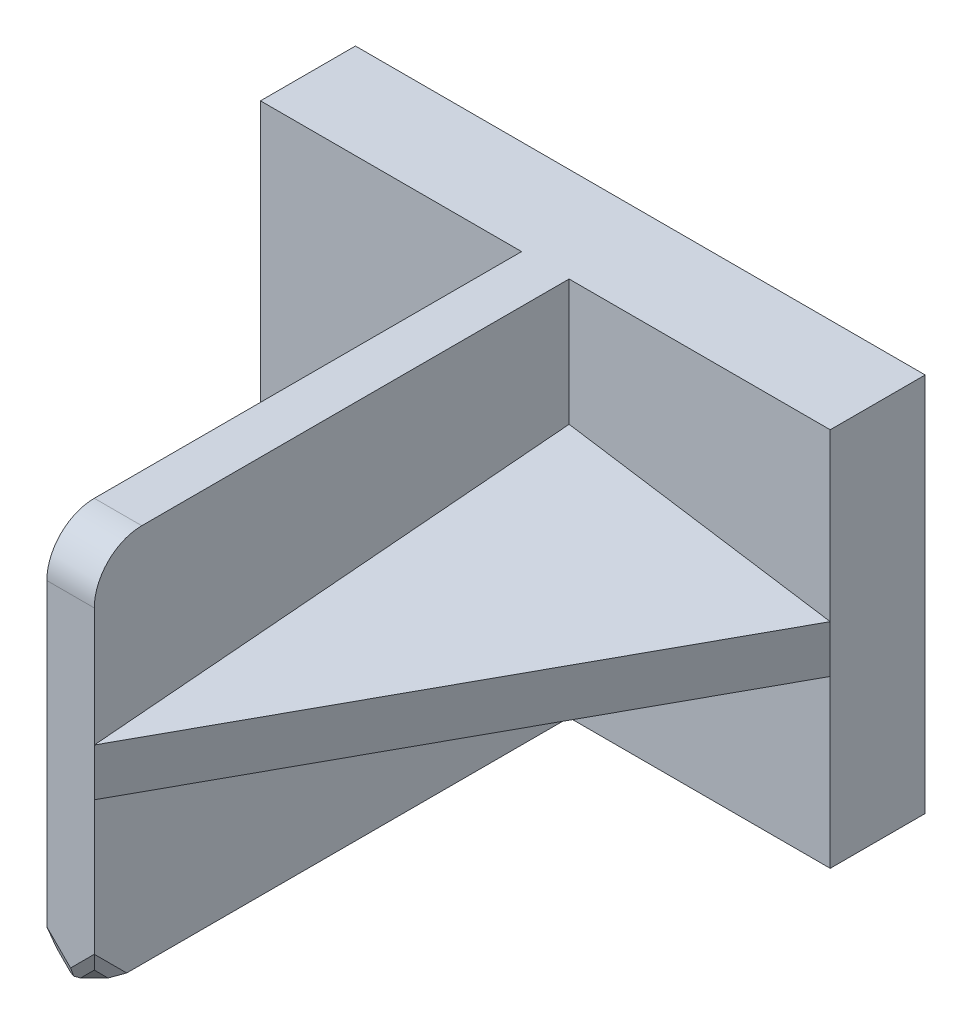
ISO-10303-21;
HEADER;
FILE_DESCRIPTION(('STEP AP214'),'2;1');
FILE_NAME('part.step','',(''),(''),'','','');
FILE_SCHEMA(('AUTOMOTIVE_DESIGN { 1 0 10303 214 1 1 1 1 }'));
ENDSEC;
DATA;
#1=APPLICATION_CONTEXT('core data for automotive mechanical design processes');
#2=APPLICATION_PROTOCOL_DEFINITION('international standard','automotive_design',2000,#1);
#3=PRODUCT_CONTEXT('',#1,'mechanical');
#4=PRODUCT('Part','Part','',(#3));
#5=PRODUCT_RELATED_PRODUCT_CATEGORY('part','',(#4));
#6=PRODUCT_DEFINITION_FORMATION('','',#4);
#7=PRODUCT_DEFINITION_CONTEXT('part definition',#1,'design');
#8=PRODUCT_DEFINITION('design','',#6,#7);
#9=PRODUCT_DEFINITION_SHAPE('','',#8);
#10=(LENGTH_UNIT() NAMED_UNIT(*) SI_UNIT(.MILLI.,.METRE.));
#11=(NAMED_UNIT(*) PLANE_ANGLE_UNIT() SI_UNIT($,.RADIAN.));
#12=(NAMED_UNIT(*) SI_UNIT($,.STERADIAN.) SOLID_ANGLE_UNIT());
#13=UNCERTAINTY_MEASURE_WITH_UNIT(LENGTH_MEASURE(1.E-05),#10,'distance_accuracy_value','');
#14=(GEOMETRIC_REPRESENTATION_CONTEXT(3) GLOBAL_UNCERTAINTY_ASSIGNED_CONTEXT((#13)) GLOBAL_UNIT_ASSIGNED_CONTEXT((#10,
#11,#12)) REPRESENTATION_CONTEXT('',''));
#15=CARTESIAN_POINT('',(0.,0.,0.));
#16=DIRECTION('',(0.,0.,1.));
#17=DIRECTION('',(1.,0.,0.));
#18=AXIS2_PLACEMENT_3D('',#15,#16,#17);
#19=CARTESIAN_POINT('',(0.,0.,20.));
#20=DIRECTION('',(0.,0.,1.));
#21=DIRECTION('',(1.,0.,0.));
#22=AXIS2_PLACEMENT_3D('',#19,#20,#21);
#23=PLANE('',#22);
#24=DIRECTION('',(0.,1.,0.));
#25=VECTOR('',#24,1.);
#26=CARTESIAN_POINT('',(60.,-40.,20.));
#27=LINE('',#26,#25);
#28=CARTESIAN_POINT('',(60.,-40.,20.));
#29=VERTEX_POINT('',#28);
#30=CARTESIAN_POINT('',(60.,-5.,20.));
#31=VERTEX_POINT('',#30);
#32=EDGE_CURVE('E204',#29,#31,#27,.T.);
#33=ORIENTED_EDGE('',*,*,#32,.T.);
#34=DIRECTION('',(-0.988274307004356,-0.152688880129039,0.));
#35=VECTOR('',#34,1.);
#36=CARTESIAN_POINT('',(2.15332613288759,-13.9373403612325,20.));
#37=LINE('',#36,#35);
#38=CARTESIAN_POINT('',(5.,-13.4975278094123,20.));
#39=VERTEX_POINT('',#38);
#40=EDGE_CURVE('E317',#31,#39,#37,.T.);
#41=ORIENTED_EDGE('',*,*,#40,.T.);
#42=DIRECTION('',(0.,1.,0.));
#43=VECTOR('',#42,1.);
#44=CARTESIAN_POINT('',(5.,40.,20.));
#45=LINE('',#44,#43);
#46=CARTESIAN_POINT('',(5.00000000000001,-40.,20.));
#47=VERTEX_POINT('',#46);
#48=EDGE_CURVE('E345',#47,#39,#45,.T.);
#49=ORIENTED_EDGE('',*,*,#48,.F.);
#50=DIRECTION('',(1.,0.,0.));
#51=VECTOR('',#50,1.);
#52=CARTESIAN_POINT('',(60.,-40.,20.));
#53=LINE('',#52,#51);
#54=EDGE_CURVE('E211',#47,#29,#53,.T.);
#55=ORIENTED_EDGE('',*,*,#54,.T.);
#56=EDGE_LOOP('',(#33,#41,#49,#55));
#57=FACE_BOUND('',#56,.T.);
#58=ADVANCED_FACE('F45',(#57),#23,.T.);
#59=CARTESIAN_POINT('',(5.,40.,120.));
#60=DIRECTION('',(-1.,0.,0.));
#61=DIRECTION('',(0.,0.,1.));
#62=AXIS2_PLACEMENT_3D('',#59,#60,#61);
#63=PLANE('',#62);
#64=DIRECTION('',(0.,1.,0.));
#65=VECTOR('',#64,1.);
#66=CARTESIAN_POINT('',(5.,40.,120.));
#67=LINE('',#66,#65);
#68=CARTESIAN_POINT('',(5.,-33.1698729810778,120.));
#69=VERTEX_POINT('',#68);
#70=CARTESIAN_POINT('',(5.,-5.,120.));
#71=VERTEX_POINT('',#70);
#72=EDGE_CURVE('E344',#69,#71,#67,.T.);
#73=ORIENTED_EDGE('',*,*,#72,.F.);
#74=DIRECTION('',(0.,-0.707106781186548,-0.707106781186548));
#75=VECTOR('',#74,1.);
#76=CARTESIAN_POINT('',(5.,-39.0849364905389,114.084936490539));
#77=LINE('',#76,#75);
#78=CARTESIAN_POINT('',(5.,-40.,113.169872981078));
#79=VERTEX_POINT('',#78);
#80=EDGE_CURVE('E383',#69,#79,#77,.T.);
#81=ORIENTED_EDGE('',*,*,#80,.T.);
#82=DIRECTION('',(0.,0.,-1.));
#83=VECTOR('',#82,1.);
#84=CARTESIAN_POINT('',(5.,-40.,120.));
#85=LINE('',#84,#83);
#86=EDGE_CURVE('E335',#79,#47,#85,.T.);
#87=ORIENTED_EDGE('',*,*,#86,.T.);
#88=ORIENTED_EDGE('',*,*,#48,.T.);
#89=DIRECTION('',(0.,-0.0846701349816076,-0.996409036612071));
#90=VECTOR('',#89,1.);
#91=CARTESIAN_POINT('',(5.,-4.67739357089883,123.796473943208));
#92=LINE('',#91,#90);
#93=EDGE_CURVE('E187',#71,#39,#92,.T.);
#94=ORIENTED_EDGE('',*,*,#93,.F.);
#95=EDGE_LOOP('',(#73,#81,#87,#88,#94));
#96=FACE_BOUND('',#95,.T.);
#97=ADVANCED_FACE('F306',(#96),#63,.F.);
#98=DIRECTION('',(0.,-1.,0.));
#99=VECTOR('',#98,1.);
#100=CARTESIAN_POINT('',(-60.,-40.,20.));
#101=LINE('',#100,#99);
#102=CARTESIAN_POINT('',(-60.,40.,20.));
#103=VERTEX_POINT('',#102);
#104=CARTESIAN_POINT('',(-60.,-40.,20.));
#105=VERTEX_POINT('',#104);
#106=EDGE_CURVE('E232',#103,#105,#101,.T.);
#107=ORIENTED_EDGE('',*,*,#106,.T.);
#108=CARTESIAN_POINT('',(-4.99999999999997,-40.,20.));
#109=VERTEX_POINT('',#108);
#110=EDGE_CURVE('E205',#105,#109,#53,.T.);
#111=ORIENTED_EDGE('',*,*,#110,.T.);
#112=DIRECTION('',(0.,-1.,0.));
#113=VECTOR('',#112,1.);
#114=CARTESIAN_POINT('',(-5.,40.,20.));
#115=LINE('',#114,#113);
#116=CARTESIAN_POINT('',(-4.99999999999997,40.,20.));
#117=VERTEX_POINT('',#116);
#118=EDGE_CURVE('E177',#117,#109,#115,.T.);
#119=ORIENTED_EDGE('',*,*,#118,.F.);
#120=DIRECTION('',(-1.,0.,0.));
#121=VECTOR('',#120,1.);
#122=CARTESIAN_POINT('',(60.,40.,20.));
#123=LINE('',#122,#121);
#124=EDGE_CURVE('E209',#117,#103,#123,.T.);
#125=ORIENTED_EDGE('',*,*,#124,.T.);
#126=EDGE_LOOP('',(#107,#111,#119,#125));
#127=FACE_BOUND('',#126,.T.);
#128=ADVANCED_FACE('F288',(#127),#23,.T.);
#129=CARTESIAN_POINT('',(-60.,-40.,20.));
#130=DIRECTION('',(1.,0.,0.));
#131=DIRECTION('',(0.,0.,-1.));
#132=AXIS2_PLACEMENT_3D('',#129,#130,#131);
#133=PLANE('',#132);
#134=DIRECTION('',(0.,0.,-1.));
#135=VECTOR('',#134,1.);
#136=CARTESIAN_POINT('',(-60.,-40.,20.));
#137=LINE('',#136,#135);
#138=CARTESIAN_POINT('',(-60.,-40.,0.));
#139=VERTEX_POINT('',#138);
#140=EDGE_CURVE('E242',#105,#139,#137,.T.);
#141=ORIENTED_EDGE('',*,*,#140,.F.);
#142=ORIENTED_EDGE('',*,*,#106,.F.);
#143=DIRECTION('',(0.,0.,-1.));
#144=VECTOR('',#143,1.);
#145=CARTESIAN_POINT('',(-60.,40.,20.));
#146=LINE('',#145,#144);
#147=CARTESIAN_POINT('',(-60.,40.,0.));
#148=VERTEX_POINT('',#147);
#149=EDGE_CURVE('E218',#103,#148,#146,.T.);
#150=ORIENTED_EDGE('',*,*,#149,.T.);
#151=DIRECTION('',(0.,-1.,0.));
#152=VECTOR('',#151,1.);
#153=CARTESIAN_POINT('',(-60.,-40.,0.));
#154=LINE('',#153,#152);
#155=EDGE_CURVE('E219',#148,#139,#154,.T.);
#156=ORIENTED_EDGE('',*,*,#155,.T.);
#157=EDGE_LOOP('',(#141,#142,#150,#156));
#158=FACE_BOUND('',#157,.T.);
#159=ADVANCED_FACE('F299',(#158),#133,.F.);
#160=CARTESIAN_POINT('',(60.,-40.,20.));
#161=DIRECTION('',(0.,1.,0.));
#162=DIRECTION('',(-1.,0.,0.));
#163=AXIS2_PLACEMENT_3D('',#160,#161,#162);
#164=PLANE('',#163);
#165=DIRECTION('',(0.707106781186547,0.,0.707106781186547));
#166=VECTOR('',#165,1.);
#167=CARTESIAN_POINT('',(-20.,-40.,100.));
#168=LINE('',#167,#166);
#169=CARTESIAN_POINT('',(-3.94337567297408,-40.,116.056624327026));
#170=VERTEX_POINT('',#169);
#171=CARTESIAN_POINT('',(-1.05662432702594,-40.,118.943375672974));
#172=VERTEX_POINT('',#171);
#173=EDGE_CURVE('E414',#170,#172,#168,.T.);
#174=ORIENTED_EDGE('',*,*,#173,.F.);
#175=DIRECTION('',(-0.343723769333441,0.,-0.939070801588044));
#176=VECTOR('',#175,1.);
#177=CARTESIAN_POINT('',(-16.2181906126948,-40.,82.5212062582035));
#178=LINE('',#177,#176);
#179=CARTESIAN_POINT('',(-5.,-40.,113.169872981078));
#180=VERTEX_POINT('',#179);
#181=EDGE_CURVE('E395',#170,#180,#178,.T.);
#182=ORIENTED_EDGE('',*,*,#181,.T.);
#183=DIRECTION('',(0.,0.,-1.));
#184=VECTOR('',#183,1.);
#185=CARTESIAN_POINT('',(-5.,-40.,120.));
#186=LINE('',#185,#184);
#187=EDGE_CURVE('E223',#180,#109,#186,.T.);
#188=ORIENTED_EDGE('',*,*,#187,.T.);
#189=ORIENTED_EDGE('',*,*,#110,.F.);
#190=ORIENTED_EDGE('',*,*,#140,.T.);
#191=DIRECTION('',(1.,0.,0.));
#192=VECTOR('',#191,1.);
#193=CARTESIAN_POINT('',(60.,-40.,0.));
#194=LINE('',#193,#192);
#195=CARTESIAN_POINT('',(60.,-40.,0.));
#196=VERTEX_POINT('',#195);
#197=EDGE_CURVE('E222',#139,#196,#194,.T.);
#198=ORIENTED_EDGE('',*,*,#197,.T.);
#199=DIRECTION('',(0.,0.,-1.));
#200=VECTOR('',#199,1.);
#201=CARTESIAN_POINT('',(60.,-40.,20.));
#202=LINE('',#201,#200);
#203=EDGE_CURVE('E238',#29,#196,#202,.T.);
#204=ORIENTED_EDGE('',*,*,#203,.F.);
#205=ORIENTED_EDGE('',*,*,#54,.F.);
#206=ORIENTED_EDGE('',*,*,#86,.F.);
#207=DIRECTION('',(-0.343723769333443,0.,0.939070801588043));
#208=VECTOR('',#207,1.);
#209=CARTESIAN_POINT('',(16.2181906126948,-40.,82.5212062582036));
#210=LINE('',#209,#208);
#211=CARTESIAN_POINT('',(3.94337567297406,-40.,116.056624327026));
#212=VERTEX_POINT('',#211);
#213=EDGE_CURVE('E398',#79,#212,#210,.T.);
#214=ORIENTED_EDGE('',*,*,#213,.T.);
#215=DIRECTION('',(0.707106781186548,0.,-0.707106781186547));
#216=VECTOR('',#215,1.);
#217=CARTESIAN_POINT('',(80.,-40.,40.));
#218=LINE('',#217,#216);
#219=CARTESIAN_POINT('',(1.05662432702597,-40.,118.943375672974));
#220=VERTEX_POINT('',#219);
#221=EDGE_CURVE('E418',#220,#212,#218,.T.);
#222=ORIENTED_EDGE('',*,*,#221,.F.);
#223=DIRECTION('',(-0.939070801588043,0.,0.343723769333445));
#224=VECTOR('',#223,1.);
#225=CARTESIAN_POINT('',(18.2278095559281,-40.,112.658285666108));
#226=LINE('',#225,#224);
#227=CARTESIAN_POINT('',(0.,-40.,119.330127018922));
#228=VERTEX_POINT('',#227);
#229=EDGE_CURVE('E401',#220,#228,#226,.T.);
#230=ORIENTED_EDGE('',*,*,#229,.T.);
#231=DIRECTION('',(-0.939070801588042,0.,-0.343723769333447));
#232=VECTOR('',#231,1.);
#233=CARTESIAN_POINT('',(-18.2278095559281,-40.,112.658285666108));
#234=LINE('',#233,#232);
#235=EDGE_CURVE('E404',#228,#172,#234,.T.);
#236=ORIENTED_EDGE('',*,*,#235,.T.);
#237=EDGE_LOOP('',(#174,#182,#188,#189,#190,#198,#204,#205,#206,#214,#222,#230,#236));
#238=FACE_BOUND('',#237,.T.);
#239=ADVANCED_FACE('F297',(#238),#164,.F.);
#240=CARTESIAN_POINT('',(60.,-40.,20.));
#241=DIRECTION('',(-1.,0.,0.));
#242=DIRECTION('',(0.,0.,1.));
#243=AXIS2_PLACEMENT_3D('',#240,#241,#242);
#244=PLANE('',#243);
#245=CARTESIAN_POINT('',(60.,5.,20.));
#246=VERTEX_POINT('',#245);
#247=CARTESIAN_POINT('',(60.,40.,20.));
#248=VERTEX_POINT('',#247);
#249=EDGE_CURVE('E193',#246,#248,#27,.T.);
#250=ORIENTED_EDGE('',*,*,#249,.F.);
#251=DIRECTION('',(0.,1.,0.));
#252=VECTOR('',#251,1.);
#253=CARTESIAN_POINT('',(60.,0.,20.));
#254=LINE('',#253,#252);
#255=EDGE_CURVE('E164',#31,#246,#254,.T.);
#256=ORIENTED_EDGE('',*,*,#255,.F.);
#257=ORIENTED_EDGE('',*,*,#32,.F.);
#258=ORIENTED_EDGE('',*,*,#203,.T.);
#259=DIRECTION('',(0.,1.,0.));
#260=VECTOR('',#259,1.);
#261=CARTESIAN_POINT('',(60.,-40.,0.));
#262=LINE('',#261,#260);
#263=CARTESIAN_POINT('',(60.,40.,0.));
#264=VERTEX_POINT('',#263);
#265=EDGE_CURVE('E226',#196,#264,#262,.T.);
#266=ORIENTED_EDGE('',*,*,#265,.T.);
#267=DIRECTION('',(0.,0.,-1.));
#268=VECTOR('',#267,1.);
#269=CARTESIAN_POINT('',(60.,40.,20.));
#270=LINE('',#269,#268);
#271=EDGE_CURVE('E201',#248,#264,#270,.T.);
#272=ORIENTED_EDGE('',*,*,#271,.F.);
#273=EDGE_LOOP('',(#250,#256,#257,#258,#266,#272));
#274=FACE_BOUND('',#273,.T.);
#275=ADVANCED_FACE('F199',(#274),#244,.F.);
#276=CARTESIAN_POINT('',(60.,40.,20.));
#277=DIRECTION('',(0.,-1.,0.));
#278=DIRECTION('',(1.,0.,0.));
#279=AXIS2_PLACEMENT_3D('',#276,#277,#278);
#280=PLANE('',#279);
#281=DIRECTION('',(0.,0.,-1.));
#282=VECTOR('',#281,1.);
#283=CARTESIAN_POINT('',(-5.,40.,120.));
#284=LINE('',#283,#282);
#285=CARTESIAN_POINT('',(-5.,40.,110.));
#286=VERTEX_POINT('',#285);
#287=EDGE_CURVE('E341',#286,#117,#284,.T.);
#288=ORIENTED_EDGE('',*,*,#287,.F.);
#289=CARTESIAN_POINT('',(25.,40.,110.));
#290=CARTESIAN_POINT('',(18.3333333333333,40.,110.));
#291=CARTESIAN_POINT('',(11.6666666666666,40.,110.));
#292=CARTESIAN_POINT('',(4.99999999999998,40.,110.));
#293=CARTESIAN_POINT('',(1.66666666666665,40.,110.));
#294=CARTESIAN_POINT('',(-1.66666666666669,40.,110.));
#295=CARTESIAN_POINT('',(-5.00000000000002,40.,110.));
#296=CARTESIAN_POINT('',(-11.6666666666667,40.,110.));
#297=CARTESIAN_POINT('',(-18.3333333333334,40.,110.));
#298=CARTESIAN_POINT('',(-25.,40.,110.));
#299=(BOUNDED_CURVE() B_SPLINE_CURVE(3,(#289,#290,#291,#292,#293,#294,#295,#296,#297,#298),
.UNSPECIFIED.,.F.,.F.) B_SPLINE_CURVE_WITH_KNOTS((4,3,3,4),(-0.02,0.,0.01,0.03),
.UNSPECIFIED.) CURVE() GEOMETRIC_REPRESENTATION_ITEM() RATIONAL_B_SPLINE_CURVE((1.,1.,1.,1.,1.,
1.,1.,1.,1.,1.)) REPRESENTATION_ITEM(''));
#300=CARTESIAN_POINT('',(5.,40.,110.));
#301=VERTEX_POINT('',#300);
#302=EDGE_CURVE('E264',#286,#301,#299,.F.);
#303=ORIENTED_EDGE('',*,*,#302,.T.);
#304=DIRECTION('',(0.,0.,-1.));
#305=VECTOR('',#304,1.);
#306=CARTESIAN_POINT('',(5.,40.,120.));
#307=LINE('',#306,#305);
#308=CARTESIAN_POINT('',(5.,40.,20.));
#309=VERTEX_POINT('',#308);
#310=EDGE_CURVE('E338',#301,#309,#307,.T.);
#311=ORIENTED_EDGE('',*,*,#310,.T.);
#312=EDGE_CURVE('E215',#248,#309,#123,.T.);
#313=ORIENTED_EDGE('',*,*,#312,.F.);
#314=ORIENTED_EDGE('',*,*,#271,.T.);
#315=DIRECTION('',(-1.,0.,0.));
#316=VECTOR('',#315,1.);
#317=CARTESIAN_POINT('',(60.,40.,0.));
#318=LINE('',#317,#316);
#319=EDGE_CURVE('E229',#264,#148,#318,.T.);
#320=ORIENTED_EDGE('',*,*,#319,.T.);
#321=ORIENTED_EDGE('',*,*,#149,.F.);
#322=ORIENTED_EDGE('',*,*,#124,.F.);
#323=EDGE_LOOP('',(#288,#303,#311,#313,#314,#320,#321,#322));
#324=FACE_BOUND('',#323,.T.);
#325=ADVANCED_FACE('F287',(#324),#280,.F.);
#326=DIRECTION('',(0.988274307004356,-0.152688880129039,0.));
#327=VECTOR('',#326,1.);
#328=CARTESIAN_POINT('',(2.15332613288759,13.9373403612325,20.));
#329=LINE('',#328,#327);
#330=CARTESIAN_POINT('',(5.,13.4975278094123,20.));
#331=VERTEX_POINT('',#330);
#332=EDGE_CURVE('E178',#246,#331,#329,.F.);
#333=ORIENTED_EDGE('',*,*,#332,.F.);
#334=ORIENTED_EDGE('',*,*,#249,.T.);
#335=ORIENTED_EDGE('',*,*,#312,.T.);
#336=EDGE_CURVE('E196',#331,#309,#45,.T.);
#337=ORIENTED_EDGE('',*,*,#336,.F.);
#338=EDGE_LOOP('',(#333,#334,#335,#337));
#339=FACE_BOUND('',#338,.T.);
#340=ADVANCED_FACE('F191',(#339),#23,.T.);
#341=CARTESIAN_POINT('',(0.,0.,0.));
#342=DIRECTION('',(0.,0.,1.));
#343=DIRECTION('',(1.,0.,0.));
#344=AXIS2_PLACEMENT_3D('',#341,#342,#343);
#345=PLANE('',#344);
#346=ORIENTED_EDGE('',*,*,#319,.F.);
#347=ORIENTED_EDGE('',*,*,#265,.F.);
#348=ORIENTED_EDGE('',*,*,#197,.F.);
#349=ORIENTED_EDGE('',*,*,#155,.F.);
#350=EDGE_LOOP('',(#346,#347,#348,#349));
#351=FACE_BOUND('',#350,.T.);
#352=ADVANCED_FACE('F281',(#351),#345,.F.);
#353=CARTESIAN_POINT('',(-5.,40.,120.));
#354=DIRECTION('',(1.,0.,0.));
#355=DIRECTION('',(0.,0.,-1.));
#356=AXIS2_PLACEMENT_3D('',#353,#354,#355);
#357=PLANE('',#356);
#358=ORIENTED_EDGE('',*,*,#187,.F.);
#359=DIRECTION('',(0.,0.707106781186548,0.707106781186548));
#360=VECTOR('',#359,1.);
#361=CARTESIAN_POINT('',(-5.,-34.0849364905389,119.084936490539));
#362=LINE('',#361,#360);
#363=CARTESIAN_POINT('',(-5.,-33.1698729810778,120.));
#364=VERTEX_POINT('',#363);
#365=EDGE_CURVE('E392',#180,#364,#362,.T.);
#366=ORIENTED_EDGE('',*,*,#365,.T.);
#367=DIRECTION('',(0.,-1.,0.));
#368=VECTOR('',#367,1.);
#369=CARTESIAN_POINT('',(-5.,40.,120.));
#370=LINE('',#369,#368);
#371=CARTESIAN_POINT('',(-5.,30.,120.));
#372=VERTEX_POINT('',#371);
#373=EDGE_CURVE('E348',#372,#364,#370,.T.);
#374=ORIENTED_EDGE('',*,*,#373,.F.);
#375=CARTESIAN_POINT('',(-5.,30.,120.));
#376=CARTESIAN_POINT('',(-5.,30.2812605913706,120.000030243782));
#377=CARTESIAN_POINT('',(-5.,30.5625168391196,119.988135141236));
#378=CARTESIAN_POINT('',(-5.,31.1230170120515,119.940712684274));
#379=CARTESIAN_POINT('',(-5.,31.402261033115,119.905186463485));
#380=CARTESIAN_POINT('',(-5.,31.9565509876437,119.810755862172));
#381=CARTESIAN_POINT('',(-5.,32.2315999338214,119.751869166882));
#382=CARTESIAN_POINT('',(-5.,32.7757590317001,119.611145995811));
#383=CARTESIAN_POINT('',(-5.,33.044869255853,119.529309800179));
#384=CARTESIAN_POINT('',(-5.,33.575369034358,119.343221694075));
#385=CARTESIAN_POINT('',(-5.,33.8367548454142,119.238959111872));
#386=CARTESIAN_POINT('',(-5.,34.3498186080474,119.008780887676));
#387=CARTESIAN_POINT('',(-5.,34.6014963541576,118.882864787705));
#388=CARTESIAN_POINT('',(-5.,35.0933031638318,118.610301372502));
#389=CARTESIAN_POINT('',(-5.,35.3334343469466,118.463657881725));
#390=CARTESIAN_POINT('',(-5.,35.8004894871768,118.150665458572));
#391=CARTESIAN_POINT('',(-5.,36.0274135154347,117.984316632357));
#392=CARTESIAN_POINT('',(-5.,36.4664411767828,117.633096563488));
#393=CARTESIAN_POINT('',(-5.,36.6785449149973,117.448225452239));
#394=CARTESIAN_POINT('',(-5.,37.0864261250989,117.061273928005));
#395=CARTESIAN_POINT('',(-5.,37.2822035966153,116.85919351463));
#396=CARTESIAN_POINT('',(-5.,37.6560787992872,116.439216881484));
#397=CARTESIAN_POINT('',(-5.,37.834172921643,116.221317449028));
#398=CARTESIAN_POINT('',(-5.,38.1713670487199,115.771292369403));
#399=CARTESIAN_POINT('',(-5.00000000000001,38.3304673457236,115.539166941231));
#400=CARTESIAN_POINT('',(-5.00000000000001,38.6285774116808,115.062285832754));
#401=CARTESIAN_POINT('',(-5.,38.7675829145393,114.817527485421));
#402=CARTESIAN_POINT('',(-5.,39.0244719520883,114.317174678455));
#403=CARTESIAN_POINT('',(-5.,39.1423558384062,114.061580399303));
#404=CARTESIAN_POINT('',(-5.,39.3561178844524,113.541476220145));
#405=CARTESIAN_POINT('',(-5.,39.452006123747,113.276970467835));
#406=CARTESIAN_POINT('',(-5.,39.6211403399068,112.740926503363));
#407=CARTESIAN_POINT('',(-5.00000000000002,39.6943917596112,112.469389998733));
#408=CARTESIAN_POINT('',(-5.00000000000002,39.8371025211096,111.83507358538));
#409=CARTESIAN_POINT('',(-5.00000000000001,39.8981870551884,111.470354927913));
#410=CARTESIAN_POINT('',(-5.,39.9592676314228,110.920348880222));
#411=CARTESIAN_POINT('',(-5.,39.9745367725207,110.736618926843));
#412=CARTESIAN_POINT('',(-5.,39.9949017292727,110.368607713583));
#413=CARTESIAN_POINT('',(-5.00000000000001,39.9999981918544,110.184326489505));
#414=CARTESIAN_POINT('',(-5.00000000000002,40.,110.));
#415=B_SPLINE_CURVE_WITH_KNOTS('',3,(#375,#376,#377,#378,#379,#380,#381,#382,#383,#384,#385,
#386,#387,#388,#389,#390,#391,#392,#393,#394,#395,#396,#397,#398,#399,#400,#401,#402,#403,#404,
#405,#406,#407,#408,#409,#410,#411,#412,#413,#414),.UNSPECIFIED.,.F.,.F.,(4,2,2,2,2,2,2,2,2,2,2,
2,2,2,2,2,2,2,2,4),(0.,0.843524225534217,1.68700798857624,2.52985440039549,3.37269052387662,
4.21592860686621,5.05918452682158,5.90228505847178,6.74538104819435,7.58847105701003,
8.43156108497184,9.27482281775599,10.1180715725067,10.9614990856436,11.804912556303,
12.6479387548296,13.4907620965666,14.5975846256286,15.1504384772058,15.7032571691341),.UNSPECIFIED.);
#416=EDGE_CURVE('E252',#372,#286,#415,.T.);
#417=ORIENTED_EDGE('',*,*,#416,.T.);
#418=ORIENTED_EDGE('',*,*,#287,.T.);
#419=ORIENTED_EDGE('',*,*,#118,.T.);
#420=EDGE_LOOP('',(#358,#366,#374,#417,#418,#419));
#421=FACE_BOUND('',#420,.T.);
#422=ADVANCED_FACE('F275',(#421),#357,.F.);
#423=ORIENTED_EDGE('',*,*,#310,.F.);
#424=CARTESIAN_POINT('',(4.99999999999998,40.,110.));
#425=CARTESIAN_POINT('',(4.99999999999999,40.0000302437821,110.281260591371));
#426=CARTESIAN_POINT('',(5.,39.9881351412365,110.56251683912));
#427=CARTESIAN_POINT('',(5.,39.9407126842738,111.123017012052));
#428=CARTESIAN_POINT('',(5.,39.9051864634849,111.402261033115));
#429=CARTESIAN_POINT('',(5.,39.8107558621721,111.956550987644));
#430=CARTESIAN_POINT('',(5.,39.7518691668823,112.231599933821));
#431=CARTESIAN_POINT('',(5.,39.6111459958113,112.7757590317));
#432=CARTESIAN_POINT('',(4.99999999999998,39.529309800179,113.044869255853));
#433=CARTESIAN_POINT('',(4.99999999999998,39.3432216940754,113.575369034358));
#434=CARTESIAN_POINT('',(5.,39.2389591118716,113.836754845414));
#435=CARTESIAN_POINT('',(5.,39.0087808876758,114.349818608047));
#436=CARTESIAN_POINT('',(5.,38.8828647877046,114.601496354158));
#437=CARTESIAN_POINT('',(5.,38.6103013725019,115.093303163832));
#438=CARTESIAN_POINT('',(5.,38.4636578817249,115.333434346947));
#439=CARTESIAN_POINT('',(5.,38.1506654585722,115.800489487177));
#440=CARTESIAN_POINT('',(4.99999999999999,37.9843166323574,116.027413515435));
#441=CARTESIAN_POINT('',(4.99999999999999,37.6330965634878,116.466441176783));
#442=CARTESIAN_POINT('',(5.,37.4482254522391,116.678544914997));
#443=CARTESIAN_POINT('',(5.,37.0612739280053,117.086426125099));
#444=CARTESIAN_POINT('',(5.,36.8591935146295,117.282203596615));
#445=CARTESIAN_POINT('',(5.,36.4392168814837,117.656078799287));
#446=CARTESIAN_POINT('',(5.,36.2213174490276,117.834172921643));
#447=CARTESIAN_POINT('',(5.,35.7712923694028,118.17136704872));
#448=CARTESIAN_POINT('',(5.,35.5391669412311,118.330467345724));
#449=CARTESIAN_POINT('',(5.,35.0622858327538,118.628577411681));
#450=CARTESIAN_POINT('',(5.,34.8175274854212,118.767582914539));
#451=CARTESIAN_POINT('',(5.,34.3171746784549,119.024471952088));
#452=CARTESIAN_POINT('',(5.,34.0615803993027,119.142355838406));
#453=CARTESIAN_POINT('',(5.,33.5414762201447,119.356117884452));
#454=CARTESIAN_POINT('',(5.,33.2769704678345,119.452006123747));
#455=CARTESIAN_POINT('',(5.,32.7409265033632,119.621140339907));
#456=CARTESIAN_POINT('',(5.,32.4693899987334,119.694391759611));
#457=CARTESIAN_POINT('',(5.,31.8350735853804,119.83710252111));
#458=CARTESIAN_POINT('',(5.,31.4703549279125,119.898187055188));
#459=CARTESIAN_POINT('',(5.,30.9203488802216,119.959267631423));
#460=CARTESIAN_POINT('',(5.,30.7366189268432,119.974536772521));
#461=CARTESIAN_POINT('',(5.,30.3686077135829,119.994901729273));
#462=CARTESIAN_POINT('',(5.,30.1843264895054,119.999998191854));
#463=CARTESIAN_POINT('',(5.,30.,120.));
#464=B_SPLINE_CURVE_WITH_KNOTS('',3,(#424,#425,#426,#427,#428,#429,#430,#431,#432,#433,#434,
#435,#436,#437,#438,#439,#440,#441,#442,#443,#444,#445,#446,#447,#448,#449,#450,#451,#452,#453,
#454,#455,#456,#457,#458,#459,#460,#461,#462,#463),.UNSPECIFIED.,.F.,.F.,(4,2,2,2,2,2,2,2,2,2,2,
2,2,2,2,2,2,2,2,4),(0.,0.843524225534227,1.68700798857624,2.52985440039548,3.37269052387662,
4.21592860686621,5.0591845268216,5.9022850584718,6.74538104819438,7.58847105701007,
8.43156108497188,9.27482281775603,10.1180715725068,10.9614990856436,11.8049125563031,
12.6479387548297,13.4907620965667,14.5975846256286,15.1504384772058,15.7032571691341),.UNSPECIFIED.);
#465=CARTESIAN_POINT('',(5.,30.,120.));
#466=VERTEX_POINT('',#465);
#467=EDGE_CURVE('E421',#301,#466,#464,.T.);
#468=ORIENTED_EDGE('',*,*,#467,.T.);
#469=CARTESIAN_POINT('',(5.,5.,120.));
#470=VERTEX_POINT('',#469);
#471=EDGE_CURVE('E355',#470,#466,#67,.T.);
#472=ORIENTED_EDGE('',*,*,#471,.F.);
#473=DIRECTION('',(0.,-0.0846701349816076,0.996409036612071));
#474=VECTOR('',#473,1.);
#475=CARTESIAN_POINT('',(5.,5.25091611152312,117.047186933061));
#476=LINE('',#475,#474);
#477=EDGE_CURVE('E184',#470,#331,#476,.F.);
#478=ORIENTED_EDGE('',*,*,#477,.T.);
#479=ORIENTED_EDGE('',*,*,#336,.T.);
#480=EDGE_LOOP('',(#423,#468,#472,#478,#479));
#481=FACE_BOUND('',#480,.T.);
#482=ADVANCED_FACE('F280',(#481),#63,.F.);
#483=CARTESIAN_POINT('',(0.,0.,120.));
#484=DIRECTION('',(0.,0.,-1.));
#485=DIRECTION('',(-1.,0.,0.));
#486=AXIS2_PLACEMENT_3D('',#483,#484,#485);
#487=PLANE('',#486);
#488=DIRECTION('',(0.707106781186548,-0.707106781186547,0.));
#489=VECTOR('',#488,1.);
#490=CARTESIAN_POINT('',(0.915063509461122,-39.0849364905389,120.));
#491=LINE('',#490,#489);
#492=CARTESIAN_POINT('',(0.,-38.1698729810778,120.));
#493=VERTEX_POINT('',#492);
#494=EDGE_CURVE('E56',#364,#493,#491,.T.);
#495=ORIENTED_EDGE('',*,*,#494,.T.);
#496=DIRECTION('',(0.707106781186548,0.707106781186547,0.));
#497=VECTOR('',#496,1.);
#498=CARTESIAN_POINT('',(4.0849364905389,-34.0849364905389,120.));
#499=LINE('',#498,#497);
#500=EDGE_CURVE('E13',#493,#69,#499,.T.);
#501=ORIENTED_EDGE('',*,*,#500,.T.);
#502=ORIENTED_EDGE('',*,*,#72,.T.);
#503=EDGE_CURVE('E354',#71,#470,#67,.T.);
#504=ORIENTED_EDGE('',*,*,#503,.T.);
#505=ORIENTED_EDGE('',*,*,#471,.T.);
#506=CARTESIAN_POINT('',(25.,30.,120.));
#507=CARTESIAN_POINT('',(18.3333333333333,30.,120.));
#508=CARTESIAN_POINT('',(11.6666666666667,30.,120.));
#509=CARTESIAN_POINT('',(5.,30.,120.));
#510=CARTESIAN_POINT('',(1.66666666666667,30.,120.));
#511=CARTESIAN_POINT('',(-1.66666666666667,30.,120.));
#512=CARTESIAN_POINT('',(-5.,30.,120.));
#513=CARTESIAN_POINT('',(-11.6666666666667,30.,120.));
#514=CARTESIAN_POINT('',(-18.3333333333333,30.,120.));
#515=CARTESIAN_POINT('',(-25.,30.,120.));
#516=(BOUNDED_CURVE() B_SPLINE_CURVE(3,(#506,#507,#508,#509,#510,#511,#512,#513,#514,#515),
.UNSPECIFIED.,.F.,.F.) B_SPLINE_CURVE_WITH_KNOTS((4,3,3,4),(-0.02,0.,0.01,0.03),
.UNSPECIFIED.) CURVE() GEOMETRIC_REPRESENTATION_ITEM() RATIONAL_B_SPLINE_CURVE((1.,1.,1.,1.,1.,
1.,1.,1.,1.,1.)) REPRESENTATION_ITEM(''));
#517=EDGE_CURVE('E246',#466,#372,#516,.T.);
#518=ORIENTED_EDGE('',*,*,#517,.T.);
#519=ORIENTED_EDGE('',*,*,#373,.T.);
#520=EDGE_LOOP('',(#495,#501,#502,#504,#505,#518,#519));
#521=FACE_BOUND('',#520,.T.);
#522=ADVANCED_FACE('F436',(#521),#487,.F.);
#523=CARTESIAN_POINT('',(60.,0.,20.));
#524=DIRECTION('',(0.876215908676647,0.,0.481918749772156));
#525=DIRECTION('',(0.481918749772156,0.,-0.876215908676647));
#526=AXIS2_PLACEMENT_3D('',#523,#524,#525);
#527=PLANE('',#526);
#528=DIRECTION('',(0.481918749772156,0.,-0.876215908676647));
#529=VECTOR('',#528,1.);
#530=CARTESIAN_POINT('',(5.,-5.,120.));
#531=LINE('',#530,#529);
#532=EDGE_CURVE('E171',#71,#31,#531,.T.);
#533=ORIENTED_EDGE('',*,*,#532,.T.);
#534=ORIENTED_EDGE('',*,*,#255,.T.);
#535=DIRECTION('',(0.481918749772156,0.,-0.876215908676647));
#536=VECTOR('',#535,1.);
#537=CARTESIAN_POINT('',(5.,5.,120.));
#538=LINE('',#537,#536);
#539=EDGE_CURVE('E168',#470,#246,#538,.T.);
#540=ORIENTED_EDGE('',*,*,#539,.F.);
#541=ORIENTED_EDGE('',*,*,#503,.F.);
#542=EDGE_LOOP('',(#533,#534,#540,#541));
#543=FACE_BOUND('',#542,.T.);
#544=ADVANCED_FACE('F166',(#543),#527,.T.);
#545=CARTESIAN_POINT('',(5.,5.,120.));
#546=DIRECTION('',(-0.152153295784474,-0.984807753012208,-0.0836843126814604));
#547=DIRECTION('',(0.988274307004356,-0.152688880129039,0.));
#548=AXIS2_PLACEMENT_3D('',#545,#546,#547);
#549=PLANE('',#548);
#550=ORIENTED_EDGE('',*,*,#539,.T.);
#551=ORIENTED_EDGE('',*,*,#332,.T.);
#552=ORIENTED_EDGE('',*,*,#477,.F.);
#553=EDGE_LOOP('',(#550,#551,#552));
#554=FACE_BOUND('',#553,.T.);
#555=ADVANCED_FACE('F182',(#554),#549,.F.);
#556=CARTESIAN_POINT('',(5.,-5.,120.));
#557=DIRECTION('',(-0.152153295784474,0.984807753012208,-0.0836843126814604));
#558=DIRECTION('',(-0.988274307004356,-0.152688880129039,0.));
#559=AXIS2_PLACEMENT_3D('',#556,#557,#558);
#560=PLANE('',#559);
#561=ORIENTED_EDGE('',*,*,#40,.F.);
#562=ORIENTED_EDGE('',*,*,#532,.F.);
#563=ORIENTED_EDGE('',*,*,#93,.T.);
#564=EDGE_LOOP('',(#561,#562,#563));
#565=FACE_BOUND('',#564,.T.);
#566=ADVANCED_FACE('F544',(#565),#560,.F.);
#567=CARTESIAN_POINT('',(7.00000000000003,30.,120.));
#568=CARTESIAN_POINT('',(6.33333333333335,30.,120.));
#569=CARTESIAN_POINT('',(5.66666666666667,30.,120.));
#570=CARTESIAN_POINT('',(5.,30.,120.));
#571=CARTESIAN_POINT('',(1.66666666666667,30.,120.));
#572=CARTESIAN_POINT('',(-1.66666666666667,30.,120.));
#573=CARTESIAN_POINT('',(-5.,30.,120.));
#574=CARTESIAN_POINT('',(-5.66666666666667,30.,120.));
#575=CARTESIAN_POINT('',(-6.33333333333333,30.,120.));
#576=CARTESIAN_POINT('',(-7.,30.,120.));
#577=CARTESIAN_POINT('',(7.00000000000002,40.,120.));
#578=CARTESIAN_POINT('',(6.33333333333335,40.,120.));
#579=CARTESIAN_POINT('',(5.66666666666667,40.,120.));
#580=CARTESIAN_POINT('',(5.,40.,120.));
#581=CARTESIAN_POINT('',(1.66666666666667,40.,120.));
#582=CARTESIAN_POINT('',(-1.66666666666667,40.,120.));
#583=CARTESIAN_POINT('',(-5.,40.,120.));
#584=CARTESIAN_POINT('',(-5.66666666666667,40.,120.));
#585=CARTESIAN_POINT('',(-6.33333333333333,40.,120.));
#586=CARTESIAN_POINT('',(-7.,40.,120.));
#587=CARTESIAN_POINT('',(7.,40.,110.));
#588=CARTESIAN_POINT('',(6.33333333333333,40.,110.));
#589=CARTESIAN_POINT('',(5.66666666666665,40.,110.));
#590=CARTESIAN_POINT('',(4.99999999999998,40.,110.));
#591=CARTESIAN_POINT('',(1.66666666666665,40.,110.));
#592=CARTESIAN_POINT('',(-1.66666666666669,40.,110.));
#593=CARTESIAN_POINT('',(-5.00000000000002,40.,110.));
#594=CARTESIAN_POINT('',(-5.66666666666669,40.,110.));
#595=CARTESIAN_POINT('',(-6.33333333333336,40.,110.));
#596=CARTESIAN_POINT('',(-7.00000000000002,40.,110.));
#597=(BOUNDED_SURFACE() B_SPLINE_SURFACE(2,3,((#567,#568,#569,#570,#571,#572,#573,#574,#575,
#576),(#577,#578,#579,#580,#581,#582,#583,#584,#585,#586),(#587,#588,#589,#590,#591,#592,#593,
#594,#595,#596)),.UNSPECIFIED.,.F.,.F.,.F.) B_SPLINE_SURFACE_WITH_KNOTS((3,3),(4,3,3,4),(0.,1.),
(-0.00200000000000003,0.,0.01,0.012),
.UNSPECIFIED.) GEOMETRIC_REPRESENTATION_ITEM() RATIONAL_B_SPLINE_SURFACE(((1.,1.,1.,1.,1.,1.,1.,
1.,1.,1.),(0.707106781186548,0.707106781186548,0.707106781186548,0.707106781186548,
0.707106781186548,0.707106781186548,0.707106781186548,0.707106781186548,0.707106781186548,
0.707106781186548),(1.,1.,1.,1.,1.,1.,1.,1.,1.,1.))) REPRESENTATION_ITEM('') SURFACE());
#598=ORIENTED_EDGE('',*,*,#467,.F.);
#599=ORIENTED_EDGE('',*,*,#302,.F.);
#600=ORIENTED_EDGE('',*,*,#416,.F.);
#601=ORIENTED_EDGE('',*,*,#517,.F.);
#602=EDGE_LOOP('',(#598,#599,#600,#601));
#603=FACE_BOUND('',#602,.T.);
#604=ADVANCED_FACE('F269',(#603),#597,.T.);
#605=CARTESIAN_POINT('',(53.3333333333333,-53.3333333333333,53.3333333333333));
#606=DIRECTION('',(0.577350269189626,-0.577350269189626,0.577350269189626));
#607=DIRECTION('',(0.,-0.707106781186548,-0.707106781186548));
#608=AXIS2_PLACEMENT_3D('',#605,#606,#607);
#609=PLANE('',#608);
#610=ORIENTED_EDGE('',*,*,#221,.T.);
#611=DIRECTION('',(0.,0.707106781186548,0.707106781186548));
#612=VECTOR('',#611,1.);
#613=CARTESIAN_POINT('',(3.94337567297405,-35.528312163513,120.528312163513));
#614=LINE('',#613,#612);
#615=CARTESIAN_POINT('',(3.94337567297405,-37.1132486540519,118.943375672974));
#616=VERTEX_POINT('',#615);
#617=EDGE_CURVE('E386',#212,#616,#614,.T.);
#618=ORIENTED_EDGE('',*,*,#617,.T.);
#619=DIRECTION('',(-0.707106781186548,-0.707106781186547,0.));
#620=VECTOR('',#619,1.);
#621=CARTESIAN_POINT('',(0.528312163512983,-40.528312163513,118.943375672974));
#622=LINE('',#621,#620);
#623=EDGE_CURVE('E389',#616,#220,#622,.T.);
#624=ORIENTED_EDGE('',*,*,#623,.T.);
#625=EDGE_LOOP('',(#610,#618,#624));
#626=FACE_BOUND('',#625,.T.);
#627=ADVANCED_FACE('F494',(#626),#609,.T.);
#628=CARTESIAN_POINT('',(-53.3333333333333,-53.3333333333333,53.3333333333333));
#629=DIRECTION('',(-0.577350269189626,-0.577350269189626,0.577350269189626));
#630=DIRECTION('',(0.,-0.707106781186547,-0.707106781186547));
#631=AXIS2_PLACEMENT_3D('',#628,#629,#630);
#632=PLANE('',#631);
#633=DIRECTION('',(-0.707106781186548,0.707106781186547,0.));
#634=VECTOR('',#633,1.);
#635=CARTESIAN_POINT('',(-5.52831216351298,-35.5283121635129,118.943375672974));
#636=LINE('',#635,#634);
#637=CARTESIAN_POINT('',(-3.94337567297407,-37.1132486540519,118.943375672974));
#638=VERTEX_POINT('',#637);
#639=EDGE_CURVE('E411',#172,#638,#636,.T.);
#640=ORIENTED_EDGE('',*,*,#639,.T.);
#641=DIRECTION('',(0.,-0.707106781186548,-0.707106781186548));
#642=VECTOR('',#641,1.);
#643=CARTESIAN_POINT('',(-3.94337567297407,-40.528312163513,115.528312163513));
#644=LINE('',#643,#642);
#645=EDGE_CURVE('E407',#638,#170,#644,.T.);
#646=ORIENTED_EDGE('',*,*,#645,.T.);
#647=ORIENTED_EDGE('',*,*,#173,.T.);
#648=EDGE_LOOP('',(#640,#646,#647));
#649=FACE_BOUND('',#648,.T.);
#650=ADVANCED_FACE('F447',(#649),#632,.T.);
#651=CARTESIAN_POINT('',(3.94337567297406,-78.028312163513,78.028312163513));
#652=DIRECTION('',(0.888073833977114,-0.32505758367187,0.32505758367187));
#653=DIRECTION('',(0.,-0.707106781186548,-0.707106781186548));
#654=AXIS2_PLACEMENT_3D('',#651,#652,#653);
#655=PLANE('',#654);
#656=ORIENTED_EDGE('',*,*,#213,.F.);
#657=ORIENTED_EDGE('',*,*,#80,.F.);
#658=DIRECTION('',(0.250562807085732,0.935113126531028,0.250562807085735));
#659=VECTOR('',#658,1.);
#660=CARTESIAN_POINT('',(8.87053292849935,-18.7248474395499,123.870532928499));
#661=LINE('',#660,#659);
#662=EDGE_CURVE('E50',#616,#69,#661,.T.);
#663=ORIENTED_EDGE('',*,*,#662,.F.);
#664=ORIENTED_EDGE('',*,*,#617,.F.);
#665=EDGE_LOOP('',(#656,#657,#663,#664));
#666=FACE_BOUND('',#665,.T.);
#667=ADVANCED_FACE('F48',(#666),#655,.T.);
#668=CARTESIAN_POINT('',(20.528312163513,-20.528312163513,118.943375672974));
#669=DIRECTION('',(0.325057583671872,-0.325057583671872,0.888073833977112));
#670=DIRECTION('',(0.707106781186548,0.707106781186547,0.));
#671=AXIS2_PLACEMENT_3D('',#668,#669,#670);
#672=PLANE('',#671);
#673=ORIENTED_EDGE('',*,*,#662,.T.);
#674=ORIENTED_EDGE('',*,*,#500,.F.);
#675=DIRECTION('',(0.,0.939070801588042,0.343723769333446));
#676=VECTOR('',#675,1.);
#677=CARTESIAN_POINT('',(0.,-22.9536507401197,125.569523889821));
#678=LINE('',#677,#676);
#679=EDGE_CURVE('E367',#228,#493,#678,.T.);
#680=ORIENTED_EDGE('',*,*,#679,.F.);
#681=ORIENTED_EDGE('',*,*,#229,.F.);
#682=ORIENTED_EDGE('',*,*,#623,.F.);
#683=EDGE_LOOP('',(#673,#674,#680,#681,#682));
#684=FACE_BOUND('',#683,.T.);
#685=ADVANCED_FACE('F451',(#684),#672,.T.);
#686=CARTESIAN_POINT('',(-20.5283121635129,-20.5283121635129,118.943375672974));
#687=DIRECTION('',(-0.325057583671874,-0.325057583671874,0.888073833977111));
#688=DIRECTION('',(0.707106781186548,-0.707106781186547,0.));
#689=AXIS2_PLACEMENT_3D('',#686,#687,#688);
#690=PLANE('',#689);
#691=ORIENTED_EDGE('',*,*,#679,.T.);
#692=ORIENTED_EDGE('',*,*,#494,.F.);
#693=DIRECTION('',(0.250562807085729,-0.935113126531028,-0.250562807085737));
#694=VECTOR('',#693,1.);
#695=CARTESIAN_POINT('',(-8.87053292849928,-18.72484743955,123.870532928499));
#696=LINE('',#695,#694);
#697=EDGE_CURVE('E373',#638,#364,#696,.F.);
#698=ORIENTED_EDGE('',*,*,#697,.F.);
#699=ORIENTED_EDGE('',*,*,#639,.F.);
#700=ORIENTED_EDGE('',*,*,#235,.F.);
#701=EDGE_LOOP('',(#691,#692,#698,#699,#700));
#702=FACE_BOUND('',#701,.T.);
#703=ADVANCED_FACE('F445',(#702),#690,.T.);
#704=CARTESIAN_POINT('',(-3.94337567297406,-78.0283121635129,78.0283121635129));
#705=DIRECTION('',(-0.888073833977115,-0.325057583671868,0.325057583671868));
#706=DIRECTION('',(0.,0.707106781186547,0.707106781186547));
#707=AXIS2_PLACEMENT_3D('',#704,#705,#706);
#708=PLANE('',#707);
#709=ORIENTED_EDGE('',*,*,#697,.T.);
#710=ORIENTED_EDGE('',*,*,#365,.F.);
#711=ORIENTED_EDGE('',*,*,#181,.F.);
#712=ORIENTED_EDGE('',*,*,#645,.F.);
#713=EDGE_LOOP('',(#709,#710,#711,#712));
#714=FACE_BOUND('',#713,.T.);
#715=ADVANCED_FACE('F441',(#714),#708,.T.);
#716=CLOSED_SHELL('',(#58,#97,#128,#159,#239,#275,#325,#340,#352,#422,#482,#522,#544,#555,#566,
#604,#627,#650,#667,#685,#703,#715));
#717=MANIFOLD_SOLID_BREP('B2',#716);
#718=ADVANCED_BREP_SHAPE_REPRESENTATION('',(#18,#717),#14);
#719=SHAPE_DEFINITION_REPRESENTATION(#9,#718);
ENDSEC;
END-ISO-10303-21;
